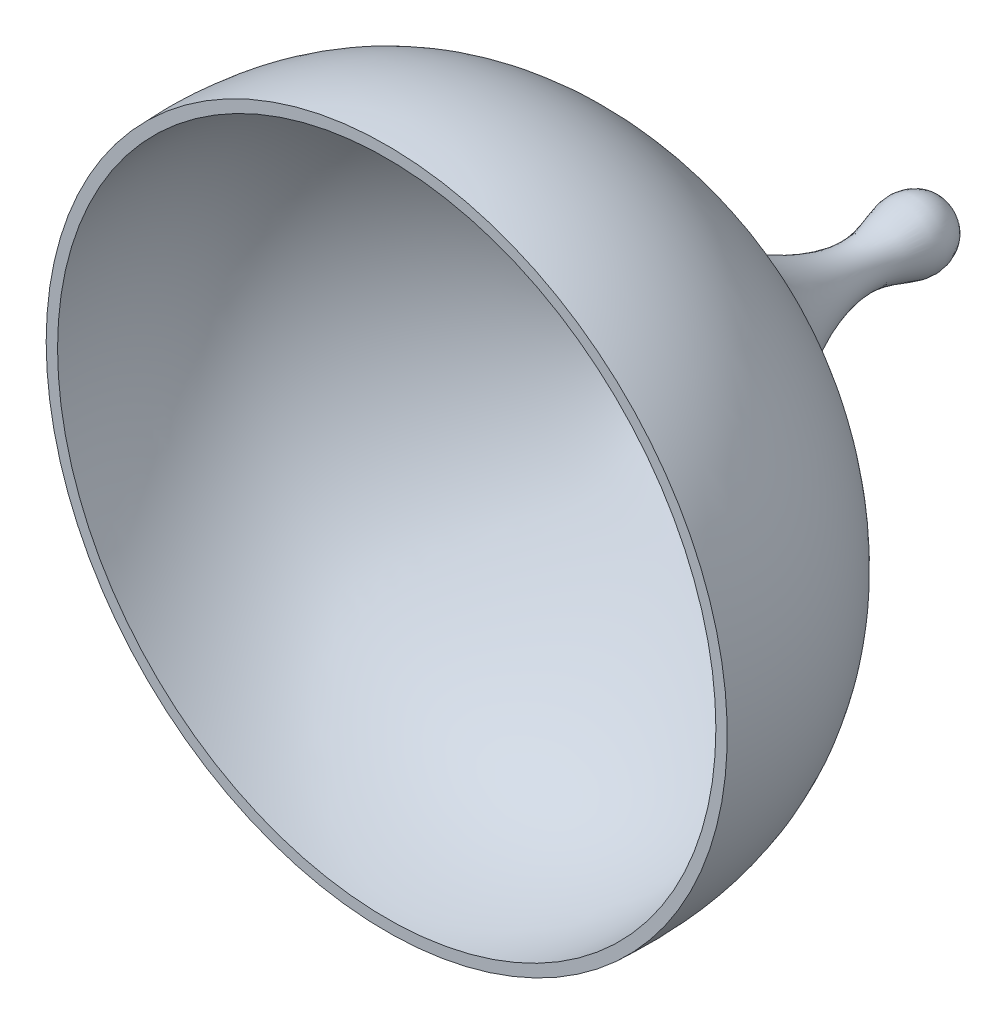
ISO-10303-21;
HEADER;
FILE_DESCRIPTION(('STEP AP214'),'2;1');
FILE_NAME('part.step','',(''),(''),'','','');
FILE_SCHEMA(('AUTOMOTIVE_DESIGN { 1 0 10303 214 1 1 1 1 }'));
ENDSEC;
DATA;
#1=APPLICATION_CONTEXT('core data for automotive mechanical design processes');
#2=APPLICATION_PROTOCOL_DEFINITION('international standard','automotive_design',2000,#1);
#3=PRODUCT_CONTEXT('',#1,'mechanical');
#4=PRODUCT('Part','Part','',(#3));
#5=PRODUCT_RELATED_PRODUCT_CATEGORY('part','',(#4));
#6=PRODUCT_DEFINITION_FORMATION('','',#4);
#7=PRODUCT_DEFINITION_CONTEXT('part definition',#1,'design');
#8=PRODUCT_DEFINITION('design','',#6,#7);
#9=PRODUCT_DEFINITION_SHAPE('','',#8);
#10=(LENGTH_UNIT() NAMED_UNIT(*) SI_UNIT(.MILLI.,.METRE.));
#11=(NAMED_UNIT(*) PLANE_ANGLE_UNIT() SI_UNIT($,.RADIAN.));
#12=(NAMED_UNIT(*) SI_UNIT($,.STERADIAN.) SOLID_ANGLE_UNIT());
#13=UNCERTAINTY_MEASURE_WITH_UNIT(LENGTH_MEASURE(1.E-05),#10,'distance_accuracy_value','');
#14=(GEOMETRIC_REPRESENTATION_CONTEXT(3) GLOBAL_UNCERTAINTY_ASSIGNED_CONTEXT((#13)) GLOBAL_UNIT_ASSIGNED_CONTEXT((#10,
#11,#12)) REPRESENTATION_CONTEXT('',''));
#15=CARTESIAN_POINT('',(0.,0.,0.));
#16=DIRECTION('',(0.,0.,1.));
#17=DIRECTION('',(1.,0.,0.));
#18=AXIS2_PLACEMENT_3D('',#15,#16,#17);
#19=CARTESIAN_POINT('',(0.,0.,17.5));
#20=DIRECTION('',(0.,0.,-1.));
#21=DIRECTION('',(-1.,0.,0.));
#22=AXIS2_PLACEMENT_3D('',#19,#20,#21);
#23=PLANE('',#22);
#24=CARTESIAN_POINT('',(0.,0.,17.5));
#25=DIRECTION('',(0.,0.,-1.));
#26=DIRECTION('',(-1.,0.,0.));
#27=AXIS2_PLACEMENT_3D('',#24,#25,#26);
#28=CIRCLE('',#27,10.765);
#29=CARTESIAN_POINT('',(-10.765,0.,17.5));
#30=VERTEX_POINT('',#29);
#31=EDGE_CURVE('E48',#30,#30,#28,.T.);
#32=ORIENTED_EDGE('',*,*,#31,.F.);
#33=EDGE_LOOP('',(#32));
#34=FACE_BOUND('',#33,.T.);
#35=CARTESIAN_POINT('',(0.,0.,17.5));
#36=DIRECTION('',(0.,0.,-1.));
#37=DIRECTION('',(-1.,0.,0.));
#38=AXIS2_PLACEMENT_3D('',#35,#36,#37);
#39=CIRCLE('',#38,10.405);
#40=CARTESIAN_POINT('',(-10.405,0.,17.5));
#41=VERTEX_POINT('',#40);
#42=EDGE_CURVE('E11',#41,#41,#39,.T.);
#43=ORIENTED_EDGE('',*,*,#42,.T.);
#44=EDGE_LOOP('',(#43));
#45=FACE_BOUND('',#44,.T.);
#46=ADVANCED_FACE('F40',(#34,#45),#23,.F.);
#47=CARTESIAN_POINT('',(-10.405,0.,17.5));
#48=CARTESIAN_POINT('',(-10.4919183762868,0.,15.9729130953559));
#49=CARTESIAN_POINT('',(-10.2898625105872,0.,13.1937866177004));
#50=CARTESIAN_POINT('',(-7.83156353923175,0.,10.5169323351518));
#51=CARTESIAN_POINT('',(-5.39877363629309,0.,8.78673269470974));
#52=CARTESIAN_POINT('',(-3.07907949401845,0.,7.55732485142242));
#53=CARTESIAN_POINT('',(-1.13271530287542,0.,5.78625697738346));
#54=CARTESIAN_POINT('',(-0.123256743904172,0.,3.46229856804595));
#55=CARTESIAN_POINT('',(-0.497765540239103,0.,1.69625763929342));
#56=CARTESIAN_POINT('',(-0.638555030970264,0.,0.71517852243929));
#57=CARTESIAN_POINT('',(-0.38627868035324,0.,0.438341376728733));
#58=CARTESIAN_POINT('',(-0.133039805930639,0.,0.447130164484582));
#59=CARTESIAN_POINT('',(0.,0.,0.455174069159156));
#60=B_SPLINE_CURVE_WITH_KNOTS('',3,(#47,#48,#49,#50,#51,#52,#53,#54,#55,#56,#57,#58,#59),
.UNSPECIFIED.,.F.,.F.,(4,1,1,1,1,1,1,1,1,1,4),(0.,0.216943180642298,0.356230711008458,
0.487330527507201,0.631026615515951,0.717013879428664,0.849541701328569,0.954579256648444,
0.967567011093796,0.980973008847537,1.),.UNSPECIFIED.);
#61=CARTESIAN_POINT('',(0.,0.,0.));
#62=DIRECTION('',(0.,0.,-1.));
#63=AXIS1_PLACEMENT('',#61,#62);
#64=SURFACE_OF_REVOLUTION('',#60,#63);
#65=CARTESIAN_POINT('',(0.,0.,0.455174069159156));
#66=VERTEX_POINT('',#65);
#67=VERTEX_LOOP('',#66);
#68=FACE_BOUND('',#67,.T.);
#69=ORIENTED_EDGE('',*,*,#42,.F.);
#70=EDGE_LOOP('',(#69));
#71=FACE_BOUND('',#70,.T.);
#72=ADVANCED_FACE('F54',(#68,#71),#64,.F.);
#73=CARTESIAN_POINT('',(-10.765,0.,17.5));
#74=CARTESIAN_POINT('',(-10.9123289416959,0.,14.5978315206043));
#75=CARTESIAN_POINT('',(-9.42953664384051,0.,10.1484645394149));
#76=CARTESIAN_POINT('',(-3.08829735016668,0.,7.33152169334797));
#77=CARTESIAN_POINT('',(-1.75733851532789,0.,5.82376272222689));
#78=CARTESIAN_POINT('',(-0.887493284093756,0.,4.0549066439246));
#79=CARTESIAN_POINT('',(-0.368296124685485,0.,2.39463877086026));
#80=CARTESIAN_POINT('',(-1.33669949242078,0.,0.771838689868984));
#81=CARTESIAN_POINT('',(-0.554994154272294,0.,-0.293704995331532));
#82=CARTESIAN_POINT('',(0.,0.,0.));
#83=B_SPLINE_CURVE_WITH_KNOTS('',3,(#73,#74,#75,#76,#77,#78,#79,#80,#81,#82),.UNSPECIFIED.,.F.,
.F.,(4,1,1,1,1,1,1,4),(0.,0.375612557136623,0.736040323906159,0.831842268395199,
0.850123240211112,0.918850042065288,0.959344166300508,1.),.UNSPECIFIED.);
#84=CARTESIAN_POINT('',(0.,0.,0.));
#85=DIRECTION('',(0.,0.,-1.));
#86=AXIS1_PLACEMENT('',#84,#85);
#87=SURFACE_OF_REVOLUTION('',#83,#86);
#88=CARTESIAN_POINT('',(0.,0.,0.));
#89=VERTEX_POINT('',#88);
#90=VERTEX_LOOP('',#89);
#91=FACE_BOUND('',#90,.T.);
#92=ORIENTED_EDGE('',*,*,#31,.T.);
#93=EDGE_LOOP('',(#92));
#94=FACE_BOUND('',#93,.T.);
#95=ADVANCED_FACE('F57',(#91,#94),#87,.T.);
#96=CLOSED_SHELL('',(#46,#72,#95));
#97=MANIFOLD_SOLID_BREP('B2',#96);
#98=ADVANCED_BREP_SHAPE_REPRESENTATION('',(#18,#97),#14);
#99=SHAPE_DEFINITION_REPRESENTATION(#9,#98);
ENDSEC;
END-ISO-10303-21;
